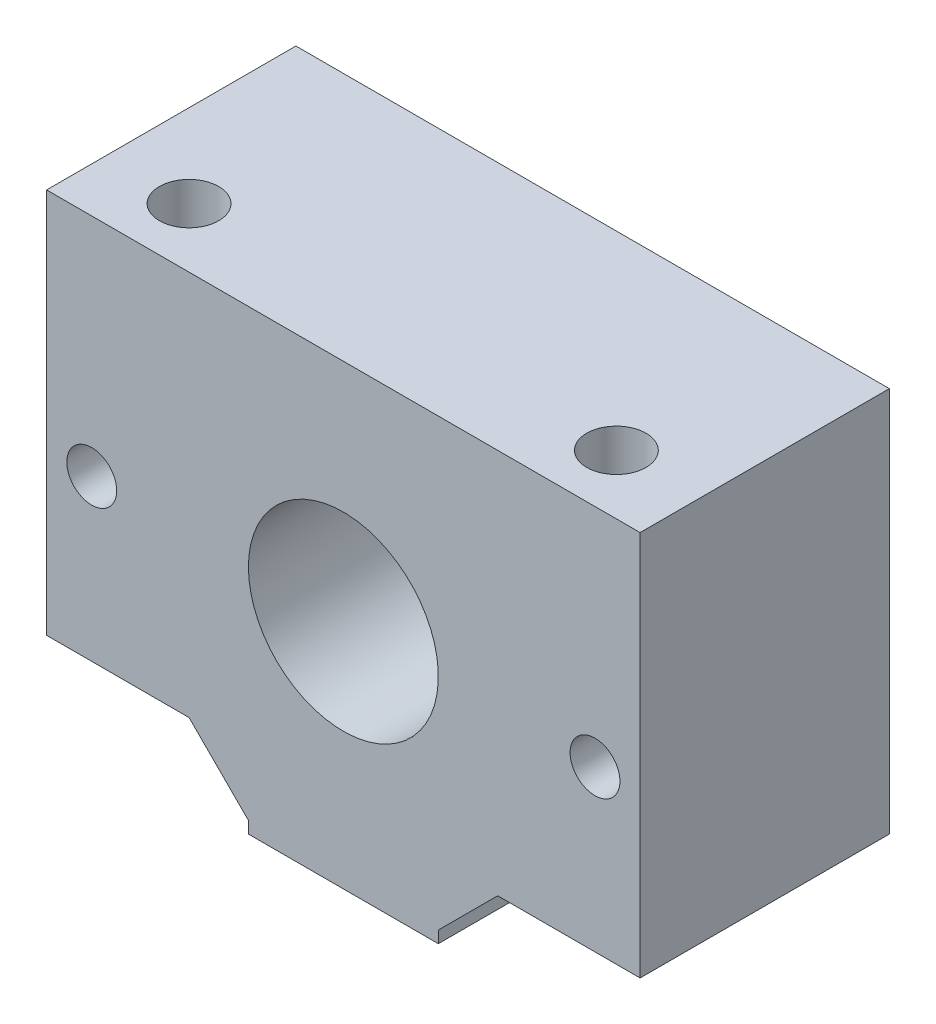
ISO-10303-21;
HEADER;
FILE_DESCRIPTION(('STEP AP214'),'2;1');
FILE_NAME('part.step','',(''),(''),'','','');
FILE_SCHEMA(('AUTOMOTIVE_DESIGN { 1 0 10303 214 1 1 1 1 }'));
ENDSEC;
DATA;
#1=APPLICATION_CONTEXT('core data for automotive mechanical design processes');
#2=APPLICATION_PROTOCOL_DEFINITION('international standard','automotive_design',2000,#1);
#3=PRODUCT_CONTEXT('',#1,'mechanical');
#4=PRODUCT('Part','Part','',(#3));
#5=PRODUCT_RELATED_PRODUCT_CATEGORY('part','',(#4));
#6=PRODUCT_DEFINITION_FORMATION('','',#4);
#7=PRODUCT_DEFINITION_CONTEXT('part definition',#1,'design');
#8=PRODUCT_DEFINITION('design','',#6,#7);
#9=PRODUCT_DEFINITION_SHAPE('','',#8);
#10=(LENGTH_UNIT() NAMED_UNIT(*) SI_UNIT(.MILLI.,.METRE.));
#11=(NAMED_UNIT(*) PLANE_ANGLE_UNIT() SI_UNIT($,.RADIAN.));
#12=(NAMED_UNIT(*) SI_UNIT($,.STERADIAN.) SOLID_ANGLE_UNIT());
#13=UNCERTAINTY_MEASURE_WITH_UNIT(LENGTH_MEASURE(1.E-05),#10,'distance_accuracy_value','');
#14=(GEOMETRIC_REPRESENTATION_CONTEXT(3) GLOBAL_UNCERTAINTY_ASSIGNED_CONTEXT((#13)) GLOBAL_UNIT_ASSIGNED_CONTEXT((#10,
#11,#12)) REPRESENTATION_CONTEXT('',''));
#15=CARTESIAN_POINT('',(0.,0.,0.));
#16=DIRECTION('',(0.,0.,1.));
#17=DIRECTION('',(1.,0.,0.));
#18=AXIS2_PLACEMENT_3D('',#15,#16,#17);
#19=CARTESIAN_POINT('',(-8.,5.99999999999999,21.));
#20=DIRECTION('',(0.,0.,1.));
#21=DIRECTION('',(1.,0.,0.));
#22=AXIS2_PLACEMENT_3D('',#19,#20,#21);
#23=PLANE('',#22);
#24=CARTESIAN_POINT('',(-21.2,19.5,21.));
#25=DIRECTION('',(0.,0.,1.));
#26=DIRECTION('',(1.,0.,0.));
#27=AXIS2_PLACEMENT_3D('',#24,#25,#26);
#28=CIRCLE('',#27,2.09999999999999);
#29=CARTESIAN_POINT('',(-19.1,19.5,21.));
#30=VERTEX_POINT('',#29);
#31=EDGE_CURVE('E300',#30,#30,#28,.T.);
#32=ORIENTED_EDGE('',*,*,#31,.F.);
#33=EDGE_LOOP('',(#32));
#34=FACE_BOUND('',#33,.T.);
#35=CARTESIAN_POINT('',(21.2,19.5,21.));
#36=DIRECTION('',(0.,0.,1.));
#37=DIRECTION('',(1.,0.,0.));
#38=AXIS2_PLACEMENT_3D('',#35,#36,#37);
#39=CIRCLE('',#38,2.09999999999999);
#40=CARTESIAN_POINT('',(23.3,19.5,21.));
#41=VERTEX_POINT('',#40);
#42=EDGE_CURVE('E294',#41,#41,#39,.T.);
#43=ORIENTED_EDGE('',*,*,#42,.F.);
#44=EDGE_LOOP('',(#43));
#45=FACE_BOUND('',#44,.T.);
#46=DIRECTION('',(0.,-1.,0.));
#47=VECTOR('',#46,1.);
#48=CARTESIAN_POINT('',(-8.,0.,21.));
#49=LINE('',#48,#47);
#50=CARTESIAN_POINT('',(-8.,0.999999999999986,21.));
#51=VERTEX_POINT('',#50);
#52=CARTESIAN_POINT('',(-8.,0.,21.));
#53=VERTEX_POINT('',#52);
#54=EDGE_CURVE('E169',#51,#53,#49,.T.);
#55=ORIENTED_EDGE('',*,*,#54,.T.);
#56=DIRECTION('',(1.,0.,0.));
#57=VECTOR('',#56,1.);
#58=CARTESIAN_POINT('',(8.,0.,21.));
#59=LINE('',#58,#57);
#60=CARTESIAN_POINT('',(8.,0.,21.));
#61=VERTEX_POINT('',#60);
#62=EDGE_CURVE('E107',#53,#61,#59,.T.);
#63=ORIENTED_EDGE('',*,*,#62,.T.);
#64=DIRECTION('',(0.,1.,0.));
#65=VECTOR('',#64,1.);
#66=CARTESIAN_POINT('',(8.,0.,21.));
#67=LINE('',#66,#65);
#68=CARTESIAN_POINT('',(8.,0.999999999999986,21.));
#69=VERTEX_POINT('',#68);
#70=EDGE_CURVE('E265',#61,#69,#67,.T.);
#71=ORIENTED_EDGE('',*,*,#70,.T.);
#72=DIRECTION('',(0.707106781186548,0.707106781186547,0.));
#73=VECTOR('',#72,1.);
#74=CARTESIAN_POINT('',(8.,0.999999999999986,21.));
#75=LINE('',#74,#73);
#76=CARTESIAN_POINT('',(13.,5.99999999999999,21.));
#77=VERTEX_POINT('',#76);
#78=EDGE_CURVE('E278',#69,#77,#75,.T.);
#79=ORIENTED_EDGE('',*,*,#78,.T.);
#80=DIRECTION('',(1.,0.,0.));
#81=VECTOR('',#80,1.);
#82=CARTESIAN_POINT('',(13.,5.99999999999999,21.));
#83=LINE('',#82,#81);
#84=CARTESIAN_POINT('',(25.,5.99999999999998,21.));
#85=VERTEX_POINT('',#84);
#86=EDGE_CURVE('E275',#77,#85,#83,.T.);
#87=ORIENTED_EDGE('',*,*,#86,.T.);
#88=DIRECTION('',(0.,1.,0.));
#89=VECTOR('',#88,1.);
#90=CARTESIAN_POINT('',(25.,5.99999999999998,21.));
#91=LINE('',#90,#89);
#92=CARTESIAN_POINT('',(25.,38.5,21.));
#93=VERTEX_POINT('',#92);
#94=EDGE_CURVE('E277',#85,#93,#91,.T.);
#95=ORIENTED_EDGE('',*,*,#94,.T.);
#96=DIRECTION('',(-1.,0.,0.));
#97=VECTOR('',#96,1.);
#98=CARTESIAN_POINT('',(-25.,38.5,21.));
#99=LINE('',#98,#97);
#100=CARTESIAN_POINT('',(-25.,38.5,21.));
#101=VERTEX_POINT('',#100);
#102=EDGE_CURVE('E132',#93,#101,#99,.T.);
#103=ORIENTED_EDGE('',*,*,#102,.T.);
#104=DIRECTION('',(0.,-1.,0.));
#105=VECTOR('',#104,1.);
#106=CARTESIAN_POINT('',(-25.,5.99999999999998,21.));
#107=LINE('',#106,#105);
#108=CARTESIAN_POINT('',(-25.,5.99999999999998,21.));
#109=VERTEX_POINT('',#108);
#110=EDGE_CURVE('E126',#101,#109,#107,.T.);
#111=ORIENTED_EDGE('',*,*,#110,.T.);
#112=DIRECTION('',(1.,0.,0.));
#113=VECTOR('',#112,1.);
#114=CARTESIAN_POINT('',(-13.,5.99999999999999,21.));
#115=LINE('',#114,#113);
#116=CARTESIAN_POINT('',(-13.,5.99999999999999,21.));
#117=VERTEX_POINT('',#116);
#118=EDGE_CURVE('E130',#109,#117,#115,.T.);
#119=ORIENTED_EDGE('',*,*,#118,.T.);
#120=DIRECTION('',(0.707106781186548,-0.707106781186547,0.));
#121=VECTOR('',#120,1.);
#122=CARTESIAN_POINT('',(-8.,0.999999999999986,21.));
#123=LINE('',#122,#121);
#124=EDGE_CURVE('E58',#117,#51,#123,.T.);
#125=ORIENTED_EDGE('',*,*,#124,.T.);
#126=EDGE_LOOP('',(#55,#63,#71,#79,#87,#95,#103,#111,#119,#125));
#127=FACE_BOUND('',#126,.T.);
#128=CARTESIAN_POINT('',(0.,19.5,21.));
#129=DIRECTION('',(0.,0.,1.));
#130=DIRECTION('',(1.,0.,0.));
#131=AXIS2_PLACEMENT_3D('',#128,#129,#130);
#132=CIRCLE('',#131,8.);
#133=CARTESIAN_POINT('',(-8.,19.5,21.));
#134=VERTEX_POINT('',#133);
#135=EDGE_CURVE('E154',#134,#134,#132,.T.);
#136=ORIENTED_EDGE('',*,*,#135,.F.);
#137=EDGE_LOOP('',(#136));
#138=FACE_BOUND('',#137,.T.);
#139=ADVANCED_FACE('F35',(#34,#45,#127,#138),#23,.T.);
#140=CARTESIAN_POINT('',(-8.,5.99999999999999,0.));
#141=DIRECTION('',(0.,0.,1.));
#142=DIRECTION('',(1.,0.,0.));
#143=AXIS2_PLACEMENT_3D('',#140,#141,#142);
#144=PLANE('',#143);
#145=CARTESIAN_POINT('',(-21.2,19.5,0.));
#146=DIRECTION('',(0.,0.,1.));
#147=DIRECTION('',(1.,0.,0.));
#148=AXIS2_PLACEMENT_3D('',#145,#146,#147);
#149=CIRCLE('',#148,2.1);
#150=CARTESIAN_POINT('',(-19.1,19.5,0.));
#151=VERTEX_POINT('',#150);
#152=EDGE_CURVE('E297',#151,#151,#149,.T.);
#153=ORIENTED_EDGE('',*,*,#152,.T.);
#154=EDGE_LOOP('',(#153));
#155=FACE_BOUND('',#154,.T.);
#156=CARTESIAN_POINT('',(21.2,19.5,0.));
#157=DIRECTION('',(0.,0.,1.));
#158=DIRECTION('',(1.,0.,0.));
#159=AXIS2_PLACEMENT_3D('',#156,#157,#158);
#160=CIRCLE('',#159,2.09999999999999);
#161=CARTESIAN_POINT('',(23.3,19.5,0.));
#162=VERTEX_POINT('',#161);
#163=EDGE_CURVE('E289',#162,#162,#160,.T.);
#164=ORIENTED_EDGE('',*,*,#163,.T.);
#165=EDGE_LOOP('',(#164));
#166=FACE_BOUND('',#165,.T.);
#167=DIRECTION('',(0.,-1.,0.));
#168=VECTOR('',#167,1.);
#169=CARTESIAN_POINT('',(-8.,0.,0.));
#170=LINE('',#169,#168);
#171=CARTESIAN_POINT('',(-8.,0.999999999999986,0.));
#172=VERTEX_POINT('',#171);
#173=CARTESIAN_POINT('',(-8.,0.,0.));
#174=VERTEX_POINT('',#173);
#175=EDGE_CURVE('E150',#172,#174,#170,.T.);
#176=ORIENTED_EDGE('',*,*,#175,.F.);
#177=DIRECTION('',(0.707106781186548,-0.707106781186547,0.));
#178=VECTOR('',#177,1.);
#179=CARTESIAN_POINT('',(-8.,0.999999999999986,0.));
#180=LINE('',#179,#178);
#181=CARTESIAN_POINT('',(-13.,5.99999999999999,0.));
#182=VERTEX_POINT('',#181);
#183=EDGE_CURVE('E99',#182,#172,#180,.T.);
#184=ORIENTED_EDGE('',*,*,#183,.F.);
#185=DIRECTION('',(1.,0.,0.));
#186=VECTOR('',#185,1.);
#187=CARTESIAN_POINT('',(-13.,5.99999999999999,0.));
#188=LINE('',#187,#186);
#189=CARTESIAN_POINT('',(-25.,5.99999999999998,0.));
#190=VERTEX_POINT('',#189);
#191=EDGE_CURVE('E93',#190,#182,#188,.T.);
#192=ORIENTED_EDGE('',*,*,#191,.F.);
#193=DIRECTION('',(0.,-1.,0.));
#194=VECTOR('',#193,1.);
#195=CARTESIAN_POINT('',(-25.,5.99999999999998,0.));
#196=LINE('',#195,#194);
#197=CARTESIAN_POINT('',(-25.,38.5,0.));
#198=VERTEX_POINT('',#197);
#199=EDGE_CURVE('E140',#198,#190,#196,.T.);
#200=ORIENTED_EDGE('',*,*,#199,.F.);
#201=DIRECTION('',(-1.,0.,0.));
#202=VECTOR('',#201,1.);
#203=CARTESIAN_POINT('',(-25.,38.5,0.));
#204=LINE('',#203,#202);
#205=CARTESIAN_POINT('',(25.,38.5,0.));
#206=VERTEX_POINT('',#205);
#207=EDGE_CURVE('E164',#206,#198,#204,.T.);
#208=ORIENTED_EDGE('',*,*,#207,.F.);
#209=DIRECTION('',(0.,1.,0.));
#210=VECTOR('',#209,1.);
#211=CARTESIAN_POINT('',(25.,5.99999999999998,0.));
#212=LINE('',#211,#210);
#213=CARTESIAN_POINT('',(25.,5.99999999999998,0.));
#214=VERTEX_POINT('',#213);
#215=EDGE_CURVE('E162',#214,#206,#212,.T.);
#216=ORIENTED_EDGE('',*,*,#215,.F.);
#217=DIRECTION('',(1.,0.,0.));
#218=VECTOR('',#217,1.);
#219=CARTESIAN_POINT('',(13.,5.99999999999999,0.));
#220=LINE('',#219,#218);
#221=CARTESIAN_POINT('',(13.,5.99999999999999,0.));
#222=VERTEX_POINT('',#221);
#223=EDGE_CURVE('E160',#222,#214,#220,.T.);
#224=ORIENTED_EDGE('',*,*,#223,.F.);
#225=DIRECTION('',(0.707106781186548,0.707106781186547,0.));
#226=VECTOR('',#225,1.);
#227=CARTESIAN_POINT('',(8.,0.999999999999986,0.));
#228=LINE('',#227,#226);
#229=CARTESIAN_POINT('',(8.,0.999999999999986,0.));
#230=VERTEX_POINT('',#229);
#231=EDGE_CURVE('E158',#230,#222,#228,.T.);
#232=ORIENTED_EDGE('',*,*,#231,.F.);
#233=DIRECTION('',(0.,1.,0.));
#234=VECTOR('',#233,1.);
#235=CARTESIAN_POINT('',(8.,0.,0.));
#236=LINE('',#235,#234);
#237=CARTESIAN_POINT('',(8.,0.,0.));
#238=VERTEX_POINT('',#237);
#239=EDGE_CURVE('E156',#238,#230,#236,.T.);
#240=ORIENTED_EDGE('',*,*,#239,.F.);
#241=DIRECTION('',(1.,0.,0.));
#242=VECTOR('',#241,1.);
#243=CARTESIAN_POINT('',(8.,0.,0.));
#244=LINE('',#243,#242);
#245=EDGE_CURVE('E153',#174,#238,#244,.T.);
#246=ORIENTED_EDGE('',*,*,#245,.F.);
#247=EDGE_LOOP('',(#176,#184,#192,#200,#208,#216,#224,#232,#240,#246));
#248=FACE_BOUND('',#247,.T.);
#249=CARTESIAN_POINT('',(0.,19.5,0.));
#250=DIRECTION('',(0.,0.,1.));
#251=DIRECTION('',(1.,0.,0.));
#252=AXIS2_PLACEMENT_3D('',#249,#250,#251);
#253=CIRCLE('',#252,8.);
#254=CARTESIAN_POINT('',(-8.,19.5,0.));
#255=VERTEX_POINT('',#254);
#256=EDGE_CURVE('E286',#255,#255,#253,.T.);
#257=ORIENTED_EDGE('',*,*,#256,.T.);
#258=EDGE_LOOP('',(#257));
#259=FACE_BOUND('',#258,.T.);
#260=ADVANCED_FACE('F215',(#155,#166,#248,#259),#144,.F.);
#261=CARTESIAN_POINT('',(-8.,0.,21.));
#262=DIRECTION('',(1.,0.,0.));
#263=DIRECTION('',(0.,0.,-1.));
#264=AXIS2_PLACEMENT_3D('',#261,#262,#263);
#265=PLANE('',#264);
#266=ORIENTED_EDGE('',*,*,#175,.T.);
#267=DIRECTION('',(0.,0.,-1.));
#268=VECTOR('',#267,1.);
#269=CARTESIAN_POINT('',(-8.,0.,21.));
#270=LINE('',#269,#268);
#271=EDGE_CURVE('E11',#53,#174,#270,.T.);
#272=ORIENTED_EDGE('',*,*,#271,.F.);
#273=ORIENTED_EDGE('',*,*,#54,.F.);
#274=DIRECTION('',(0.,0.,-1.));
#275=VECTOR('',#274,1.);
#276=CARTESIAN_POINT('',(-8.,0.999999999999986,21.));
#277=LINE('',#276,#275);
#278=EDGE_CURVE('E146',#51,#172,#277,.T.);
#279=ORIENTED_EDGE('',*,*,#278,.T.);
#280=EDGE_LOOP('',(#266,#272,#273,#279));
#281=FACE_BOUND('',#280,.T.);
#282=ADVANCED_FACE('F37',(#281),#265,.F.);
#283=CARTESIAN_POINT('',(8.,0.,21.));
#284=DIRECTION('',(0.,1.,0.));
#285=DIRECTION('',(0.,0.,1.));
#286=AXIS2_PLACEMENT_3D('',#283,#284,#285);
#287=PLANE('',#286);
#288=ORIENTED_EDGE('',*,*,#245,.T.);
#289=DIRECTION('',(0.,0.,-1.));
#290=VECTOR('',#289,1.);
#291=CARTESIAN_POINT('',(8.,0.,21.));
#292=LINE('',#291,#290);
#293=EDGE_CURVE('E49',#61,#238,#292,.T.);
#294=ORIENTED_EDGE('',*,*,#293,.F.);
#295=ORIENTED_EDGE('',*,*,#62,.F.);
#296=ORIENTED_EDGE('',*,*,#271,.T.);
#297=EDGE_LOOP('',(#288,#294,#295,#296));
#298=FACE_BOUND('',#297,.T.);
#299=ADVANCED_FACE('F252',(#298),#287,.F.);
#300=CARTESIAN_POINT('',(8.,0.,21.));
#301=DIRECTION('',(-1.,0.,0.));
#302=DIRECTION('',(0.,0.,1.));
#303=AXIS2_PLACEMENT_3D('',#300,#301,#302);
#304=PLANE('',#303);
#305=ORIENTED_EDGE('',*,*,#239,.T.);
#306=DIRECTION('',(0.,0.,-1.));
#307=VECTOR('',#306,1.);
#308=CARTESIAN_POINT('',(8.,0.999999999999986,21.));
#309=LINE('',#308,#307);
#310=EDGE_CURVE('E182',#69,#230,#309,.T.);
#311=ORIENTED_EDGE('',*,*,#310,.F.);
#312=ORIENTED_EDGE('',*,*,#70,.F.);
#313=ORIENTED_EDGE('',*,*,#293,.T.);
#314=EDGE_LOOP('',(#305,#311,#312,#313));
#315=FACE_BOUND('',#314,.T.);
#316=ADVANCED_FACE('F249',(#315),#304,.F.);
#317=CARTESIAN_POINT('',(8.,0.999999999999986,21.));
#318=DIRECTION('',(-0.707106781186547,0.707106781186548,0.));
#319=DIRECTION('',(-0.707106781186548,-0.707106781186547,0.));
#320=AXIS2_PLACEMENT_3D('',#317,#318,#319);
#321=PLANE('',#320);
#322=ORIENTED_EDGE('',*,*,#231,.T.);
#323=DIRECTION('',(0.,0.,-1.));
#324=VECTOR('',#323,1.);
#325=CARTESIAN_POINT('',(13.,5.99999999999999,21.));
#326=LINE('',#325,#324);
#327=EDGE_CURVE('E179',#77,#222,#326,.T.);
#328=ORIENTED_EDGE('',*,*,#327,.F.);
#329=ORIENTED_EDGE('',*,*,#78,.F.);
#330=ORIENTED_EDGE('',*,*,#310,.T.);
#331=EDGE_LOOP('',(#322,#328,#329,#330));
#332=FACE_BOUND('',#331,.T.);
#333=ADVANCED_FACE('F245',(#332),#321,.F.);
#334=CARTESIAN_POINT('',(13.,5.99999999999999,21.));
#335=DIRECTION('',(0.,1.,0.));
#336=DIRECTION('',(-1.,0.,0.));
#337=AXIS2_PLACEMENT_3D('',#334,#335,#336);
#338=PLANE('',#337);
#339=CARTESIAN_POINT('',(18.,5.99999999999998,16.));
#340=DIRECTION('',(0.,1.,0.));
#341=DIRECTION('',(-1.,0.,0.));
#342=AXIS2_PLACEMENT_3D('',#339,#340,#341);
#343=CIRCLE('',#342,2.49999999999999);
#344=CARTESIAN_POINT('',(15.5,5.99999999999998,16.));
#345=VERTEX_POINT('',#344);
#346=EDGE_CURVE('E192',#345,#345,#343,.T.);
#347=ORIENTED_EDGE('',*,*,#346,.T.);
#348=EDGE_LOOP('',(#347));
#349=FACE_BOUND('',#348,.T.);
#350=ORIENTED_EDGE('',*,*,#223,.T.);
#351=DIRECTION('',(0.,0.,-1.));
#352=VECTOR('',#351,1.);
#353=CARTESIAN_POINT('',(25.,5.99999999999998,21.));
#354=LINE('',#353,#352);
#355=EDGE_CURVE('E176',#85,#214,#354,.T.);
#356=ORIENTED_EDGE('',*,*,#355,.F.);
#357=ORIENTED_EDGE('',*,*,#86,.F.);
#358=ORIENTED_EDGE('',*,*,#327,.T.);
#359=EDGE_LOOP('',(#350,#356,#357,#358));
#360=FACE_BOUND('',#359,.T.);
#361=ADVANCED_FACE('F241',(#349,#360),#338,.F.);
#362=CARTESIAN_POINT('',(25.,5.99999999999998,21.));
#363=DIRECTION('',(-1.,0.,0.));
#364=DIRECTION('',(0.,0.,1.));
#365=AXIS2_PLACEMENT_3D('',#362,#363,#364);
#366=PLANE('',#365);
#367=ORIENTED_EDGE('',*,*,#215,.T.);
#368=DIRECTION('',(0.,0.,-1.));
#369=VECTOR('',#368,1.);
#370=CARTESIAN_POINT('',(25.,38.5,21.));
#371=LINE('',#370,#369);
#372=EDGE_CURVE('E173',#93,#206,#371,.T.);
#373=ORIENTED_EDGE('',*,*,#372,.F.);
#374=ORIENTED_EDGE('',*,*,#94,.F.);
#375=ORIENTED_EDGE('',*,*,#355,.T.);
#376=EDGE_LOOP('',(#367,#373,#374,#375));
#377=FACE_BOUND('',#376,.T.);
#378=ADVANCED_FACE('F237',(#377),#366,.F.);
#379=CARTESIAN_POINT('',(-25.,38.5,21.));
#380=DIRECTION('',(0.,-1.,0.));
#381=DIRECTION('',(0.,0.,-1.));
#382=AXIS2_PLACEMENT_3D('',#379,#380,#381);
#383=PLANE('',#382);
#384=CARTESIAN_POINT('',(-18.,38.5,16.));
#385=DIRECTION('',(0.,1.,0.));
#386=DIRECTION('',(0.,0.,1.));
#387=AXIS2_PLACEMENT_3D('',#384,#385,#386);
#388=CIRCLE('',#387,2.49999999999999);
#389=CARTESIAN_POINT('',(-18.,38.5,18.5));
#390=VERTEX_POINT('',#389);
#391=EDGE_CURVE('E310',#390,#390,#388,.T.);
#392=ORIENTED_EDGE('',*,*,#391,.F.);
#393=EDGE_LOOP('',(#392));
#394=FACE_BOUND('',#393,.T.);
#395=CARTESIAN_POINT('',(18.,38.5,16.));
#396=DIRECTION('',(0.,1.,0.));
#397=DIRECTION('',(0.,0.,1.));
#398=AXIS2_PLACEMENT_3D('',#395,#396,#397);
#399=CIRCLE('',#398,2.49999999999999);
#400=CARTESIAN_POINT('',(18.,38.5,18.5));
#401=VERTEX_POINT('',#400);
#402=EDGE_CURVE('E193',#401,#401,#399,.T.);
#403=ORIENTED_EDGE('',*,*,#402,.F.);
#404=EDGE_LOOP('',(#403));
#405=FACE_BOUND('',#404,.T.);
#406=ORIENTED_EDGE('',*,*,#207,.T.);
#407=DIRECTION('',(0.,0.,-1.));
#408=VECTOR('',#407,1.);
#409=CARTESIAN_POINT('',(-25.,38.5,21.));
#410=LINE('',#409,#408);
#411=EDGE_CURVE('E141',#101,#198,#410,.T.);
#412=ORIENTED_EDGE('',*,*,#411,.F.);
#413=ORIENTED_EDGE('',*,*,#102,.F.);
#414=ORIENTED_EDGE('',*,*,#372,.T.);
#415=EDGE_LOOP('',(#406,#412,#413,#414));
#416=FACE_BOUND('',#415,.T.);
#417=ADVANCED_FACE('F234',(#394,#405,#416),#383,.F.);
#418=CARTESIAN_POINT('',(-25.,5.99999999999998,21.));
#419=DIRECTION('',(1.,0.,0.));
#420=DIRECTION('',(0.,0.,-1.));
#421=AXIS2_PLACEMENT_3D('',#418,#419,#420);
#422=PLANE('',#421);
#423=ORIENTED_EDGE('',*,*,#199,.T.);
#424=DIRECTION('',(0.,0.,-1.));
#425=VECTOR('',#424,1.);
#426=CARTESIAN_POINT('',(-25.,5.99999999999998,21.));
#427=LINE('',#426,#425);
#428=EDGE_CURVE('E137',#109,#190,#427,.T.);
#429=ORIENTED_EDGE('',*,*,#428,.F.);
#430=ORIENTED_EDGE('',*,*,#110,.F.);
#431=ORIENTED_EDGE('',*,*,#411,.T.);
#432=EDGE_LOOP('',(#423,#429,#430,#431));
#433=FACE_BOUND('',#432,.T.);
#434=ADVANCED_FACE('F138',(#433),#422,.F.);
#435=CARTESIAN_POINT('',(-13.,5.99999999999999,21.));
#436=DIRECTION('',(0.,1.,0.));
#437=DIRECTION('',(-1.,0.,0.));
#438=AXIS2_PLACEMENT_3D('',#435,#436,#437);
#439=PLANE('',#438);
#440=CARTESIAN_POINT('',(-18.,5.99999999999998,16.));
#441=DIRECTION('',(0.,1.,0.));
#442=DIRECTION('',(-1.,0.,0.));
#443=AXIS2_PLACEMENT_3D('',#440,#441,#442);
#444=CIRCLE('',#443,2.49999999999999);
#445=CARTESIAN_POINT('',(-20.5,5.99999999999998,16.));
#446=VERTEX_POINT('',#445);
#447=EDGE_CURVE('E307',#446,#446,#444,.T.);
#448=ORIENTED_EDGE('',*,*,#447,.T.);
#449=EDGE_LOOP('',(#448));
#450=FACE_BOUND('',#449,.T.);
#451=ORIENTED_EDGE('',*,*,#191,.T.);
#452=DIRECTION('',(0.,0.,-1.));
#453=VECTOR('',#452,1.);
#454=CARTESIAN_POINT('',(-13.,5.99999999999999,21.));
#455=LINE('',#454,#453);
#456=EDGE_CURVE('E142',#117,#182,#455,.T.);
#457=ORIENTED_EDGE('',*,*,#456,.F.);
#458=ORIENTED_EDGE('',*,*,#118,.F.);
#459=ORIENTED_EDGE('',*,*,#428,.T.);
#460=EDGE_LOOP('',(#451,#457,#458,#459));
#461=FACE_BOUND('',#460,.T.);
#462=ADVANCED_FACE('F144',(#450,#461),#439,.F.);
#463=CARTESIAN_POINT('',(-8.,0.999999999999986,21.));
#464=DIRECTION('',(0.707106781186547,0.707106781186548,0.));
#465=DIRECTION('',(-0.707106781186548,0.707106781186547,0.));
#466=AXIS2_PLACEMENT_3D('',#463,#464,#465);
#467=PLANE('',#466);
#468=ORIENTED_EDGE('',*,*,#183,.T.);
#469=ORIENTED_EDGE('',*,*,#278,.F.);
#470=ORIENTED_EDGE('',*,*,#124,.F.);
#471=ORIENTED_EDGE('',*,*,#456,.T.);
#472=EDGE_LOOP('',(#468,#469,#470,#471));
#473=FACE_BOUND('',#472,.T.);
#474=ADVANCED_FACE('F226',(#473),#467,.F.);
#475=CARTESIAN_POINT('',(0.,19.5,21.));
#476=DIRECTION('',(0.,0.,-1.));
#477=DIRECTION('',(-1.,0.,0.));
#478=AXIS2_PLACEMENT_3D('',#475,#476,#477);
#479=CYLINDRICAL_SURFACE('',#478,8.);
#480=CARTESIAN_POINT('',(-8.,19.5,21.));
#481=CARTESIAN_POINT('',(-8.,19.5,20.78125));
#482=CARTESIAN_POINT('',(-8.,19.5,20.5625));
#483=CARTESIAN_POINT('',(-8.,19.5,20.125));
#484=CARTESIAN_POINT('',(-8.,19.5,19.90625));
#485=CARTESIAN_POINT('',(-8.,19.5,19.46875));
#486=CARTESIAN_POINT('',(-8.,19.5,19.25));
#487=CARTESIAN_POINT('',(-8.,19.5,18.8125));
#488=CARTESIAN_POINT('',(-8.,19.5,18.59375));
#489=CARTESIAN_POINT('',(-8.,19.5,18.15625));
#490=CARTESIAN_POINT('',(-8.,19.5,17.9375));
#491=CARTESIAN_POINT('',(-8.,19.5,17.5));
#492=CARTESIAN_POINT('',(-8.,19.5,17.28125));
#493=CARTESIAN_POINT('',(-8.,19.5,16.84375));
#494=CARTESIAN_POINT('',(-8.,19.5,16.625));
#495=CARTESIAN_POINT('',(-8.,19.5,16.1875));
#496=CARTESIAN_POINT('',(-8.,19.5,15.96875));
#497=CARTESIAN_POINT('',(-8.,19.5,15.53125));
#498=CARTESIAN_POINT('',(-8.,19.5,15.3125));
#499=CARTESIAN_POINT('',(-8.,19.5,14.875));
#500=CARTESIAN_POINT('',(-8.,19.5,14.65625));
#501=CARTESIAN_POINT('',(-8.,19.5,14.21875));
#502=CARTESIAN_POINT('',(-8.,19.5,14.));
#503=CARTESIAN_POINT('',(-8.,19.5,13.5625));
#504=CARTESIAN_POINT('',(-8.,19.5,13.34375));
#505=CARTESIAN_POINT('',(-8.,19.5,12.90625));
#506=CARTESIAN_POINT('',(-8.,19.5,12.6875));
#507=CARTESIAN_POINT('',(-8.,19.5,12.25));
#508=CARTESIAN_POINT('',(-8.,19.5,12.03125));
#509=CARTESIAN_POINT('',(-8.,19.5,11.59375));
#510=CARTESIAN_POINT('',(-8.,19.5,11.375));
#511=CARTESIAN_POINT('',(-8.,19.5,10.9375));
#512=CARTESIAN_POINT('',(-8.,19.5,10.71875));
#513=CARTESIAN_POINT('',(-8.,19.5,10.28125));
#514=CARTESIAN_POINT('',(-8.,19.5,10.0625));
#515=CARTESIAN_POINT('',(-8.,19.5,9.625));
#516=CARTESIAN_POINT('',(-8.,19.5,9.40625));
#517=CARTESIAN_POINT('',(-8.,19.5,8.96875));
#518=CARTESIAN_POINT('',(-8.,19.5,8.75));
#519=CARTESIAN_POINT('',(-8.,19.5,8.3125));
#520=CARTESIAN_POINT('',(-8.,19.5,8.09375));
#521=CARTESIAN_POINT('',(-8.,19.5,7.65625));
#522=CARTESIAN_POINT('',(-8.,19.5,7.4375));
#523=CARTESIAN_POINT('',(-8.,19.5,7.));
#524=CARTESIAN_POINT('',(-8.,19.5,6.78125));
#525=CARTESIAN_POINT('',(-8.,19.5,6.34375));
#526=CARTESIAN_POINT('',(-8.,19.5,6.125));
#527=CARTESIAN_POINT('',(-8.,19.5,5.6875));
#528=CARTESIAN_POINT('',(-8.,19.5,5.46875));
#529=CARTESIAN_POINT('',(-8.,19.5,5.03125));
#530=CARTESIAN_POINT('',(-8.,19.5,4.8125));
#531=CARTESIAN_POINT('',(-8.,19.5,4.375));
#532=CARTESIAN_POINT('',(-8.,19.5,4.15625));
#533=CARTESIAN_POINT('',(-8.,19.5,3.71875));
#534=CARTESIAN_POINT('',(-8.,19.5,3.5));
#535=CARTESIAN_POINT('',(-8.,19.5,3.0625));
#536=CARTESIAN_POINT('',(-8.,19.5,2.84375));
#537=CARTESIAN_POINT('',(-8.,19.5,2.40625));
#538=CARTESIAN_POINT('',(-8.,19.5,2.1875));
#539=CARTESIAN_POINT('',(-8.,19.5,1.75));
#540=CARTESIAN_POINT('',(-8.,19.5,1.53125));
#541=CARTESIAN_POINT('',(-8.,19.5,1.09375));
#542=CARTESIAN_POINT('',(-8.,19.5,0.875000000000001));
#543=CARTESIAN_POINT('',(-8.,19.5,0.4375));
#544=CARTESIAN_POINT('',(-8.,19.5,0.21875));
#545=CARTESIAN_POINT('',(-8.,19.5,0.));
#546=B_SPLINE_CURVE_WITH_KNOTS('',3,(#480,#481,#482,#483,#484,#485,#486,#487,#488,#489,#490,
#491,#492,#493,#494,#495,#496,#497,#498,#499,#500,#501,#502,#503,#504,#505,#506,#507,#508,#509,
#510,#511,#512,#513,#514,#515,#516,#517,#518,#519,#520,#521,#522,#523,#524,#525,#526,#527,#528,
#529,#530,#531,#532,#533,#534,#535,#536,#537,#538,#539,#540,#541,#542,#543,#544,#545),
.UNSPECIFIED.,.F.,.F.,(4,2,2,2,2,2,2,2,2,2,2,2,2,2,2,2,2,2,2,2,2,2,2,2,2,2,2,2,2,2,2,2,4),(0.,
0.656249999999997,1.3125,1.96875,2.625,3.28125,3.9375,4.59375,5.25,5.90625,6.5625,7.21875,7.875,
8.53125,9.1875,9.84375,10.5,11.15625,11.8125,12.46875,13.125,13.78125,14.4375,15.09375,15.75,
16.40625,17.0625,17.71875,18.375,19.03125,19.6875,20.34375,21.),.UNSPECIFIED.);
#547=EDGE_CURVE('BSEAM210',#134,#255,#546,.T.);
#548=ORIENTED_EDGE('',*,*,#135,.T.);
#549=ORIENTED_EDGE('',*,*,#256,.F.);
#550=ORIENTED_EDGE('',*,*,#547,.T.);
#551=ORIENTED_EDGE('',*,*,#547,.F.);
#552=EDGE_LOOP('',(#548,#550,#549,#551));
#553=FACE_BOUND('',#552,.T.);
#554=ADVANCED_FACE('F210',(#553),#479,.F.);
#555=CARTESIAN_POINT('',(21.2,19.5,21.));
#556=DIRECTION('',(0.,0.,1.));
#557=DIRECTION('',(1.,0.,0.));
#558=AXIS2_PLACEMENT_3D('',#555,#556,#557);
#559=CYLINDRICAL_SURFACE('',#558,2.09999999999999);
#560=CARTESIAN_POINT('',(19.1,19.5,13.7550055679356));
#561=CARTESIAN_POINT('',(19.1000051974505,19.3966815992943,13.7550018119441));
#562=CARTESIAN_POINT('',(19.1076594967822,19.2932855370379,13.7587085043693));
#563=CARTESIAN_POINT('',(19.1379842696764,19.0891998260586,13.773956266454));
#564=CARTESIAN_POINT('',(19.1606743747851,18.9885138949131,13.785507578956));
#565=CARTESIAN_POINT('',(19.220057642718,18.792681415827,13.8176623067301));
#566=CARTESIAN_POINT('',(19.2567702564892,18.6975427749123,13.8382783018656));
#567=CARTESIAN_POINT('',(19.3421130498353,18.5159769140341,13.8902107727518));
#568=CARTESIAN_POINT('',(19.3907337444602,18.4295428377116,13.921518739989));
#569=CARTESIAN_POINT('',(19.4949458606844,18.2705525503866,13.995240069803));
#570=CARTESIAN_POINT('',(19.5502699194869,18.1976453368419,14.0372731453935));
#571=CARTESIAN_POINT('',(19.6649843828705,18.0642175521122,14.1336094911282));
#572=CARTESIAN_POINT('',(19.7243737008053,18.0036936879714,14.1879094911736));
#573=CARTESIAN_POINT('',(19.8403589996704,17.8977150153085,14.3059968731808));
#574=CARTESIAN_POINT('',(19.8969714980847,17.8517532776844,14.3693165192878));
#575=CARTESIAN_POINT('',(20.0061995655304,17.7709926200439,14.5057425769906));
#576=CARTESIAN_POINT('',(20.0588136310451,17.7361978834192,14.5788526417794));
#577=CARTESIAN_POINT('',(20.1602973944514,17.6744096822512,14.7380269091796));
#578=CARTESIAN_POINT('',(20.2087212311002,17.6480471379279,14.8246174590719));
#579=CARTESIAN_POINT('',(20.2955447280111,17.6041278315202,15.0047632299241));
#580=CARTESIAN_POINT('',(20.3339389412221,17.5865758496706,15.0983222001092));
#581=CARTESIAN_POINT('',(20.4040243974212,17.5562665594663,15.304206157055));
#582=CARTESIAN_POINT('',(20.4339472024859,17.5445675610727,15.417290144575));
#583=CARTESIAN_POINT('',(20.4777218552421,17.5279814842226,15.6470244977199));
#584=CARTESIAN_POINT('',(20.4915654477426,17.5230979045952,15.7636766637611));
#585=CARTESIAN_POINT('',(20.5033333548309,17.5189109493985,16.0101880978635));
#586=CARTESIAN_POINT('',(20.4994330299465,17.5202475085394,16.1401477277786));
#587=CARTESIAN_POINT('',(20.4715491229293,17.5303337983583,16.3977522709354));
#588=CARTESIAN_POINT('',(20.4475552109153,17.5390873420498,16.525395959088));
#589=CARTESIAN_POINT('',(20.3970296713097,17.5594968949423,16.713138291251));
#590=CARTESIAN_POINT('',(20.3775397991907,17.5676125198055,16.7756041316274));
#591=CARTESIAN_POINT('',(20.3338994697597,17.5867714498077,16.8984149912262));
#592=CARTESIAN_POINT('',(20.3097511323347,17.5978134241295,16.9587609604103));
#593=CARTESIAN_POINT('',(20.2571553517496,17.6233285256155,17.0767648106955));
#594=CARTESIAN_POINT('',(20.228709857176,17.6378000992785,17.1344238947622));
#595=CARTESIAN_POINT('',(20.1680110493227,17.6707404501898,17.2465098025973));
#596=CARTESIAN_POINT('',(20.1357582832576,17.6892086533245,17.3009370891823));
#597=CARTESIAN_POINT('',(20.070973626089,17.7289501217924,17.4015495739823));
#598=CARTESIAN_POINT('',(20.0386946704325,17.7498554679473,17.4480427603272));
#599=CARTESIAN_POINT('',(19.9721778020407,17.7958617321652,17.5374056164319));
#600=CARTESIAN_POINT('',(19.9379403008955,17.8209617708246,17.580276042861));
#601=CARTESIAN_POINT('',(19.8683382249567,17.8756144103053,17.6619830139238));
#602=CARTESIAN_POINT('',(19.8329751200436,17.9051613781256,17.7008245583413));
#603=CARTESIAN_POINT('',(19.7620008364458,17.9688443616114,17.7742506741759));
#604=CARTESIAN_POINT('',(19.7263897023469,18.0029795717046,17.8088359908353));
#605=CARTESIAN_POINT('',(19.6314038724832,18.1011301022017,17.8960664137347));
#606=CARTESIAN_POINT('',(19.572645902038,18.1694707426121,17.9446376323925));
#607=CARTESIAN_POINT('',(19.4617060804989,18.3180775813011,18.0293664009548));
#608=CARTESIAN_POINT('',(19.4095251187598,18.3983453892015,18.0655222731719));
#609=CARTESIAN_POINT('',(19.317883625704,18.563984621859,18.1250921838401));
#610=CARTESIAN_POINT('',(19.2778959987234,18.6488610489386,18.1490793447348));
#611=CARTESIAN_POINT('',(19.2092176838329,18.824927737171,18.1884620713134));
#612=CARTESIAN_POINT('',(19.1805286265709,18.9161189074576,18.2038563969838));
#613=CARTESIAN_POINT('',(19.1346345817852,19.1070847752352,18.2278500059799));
#614=CARTESIAN_POINT('',(19.1180711574379,19.2070608256296,18.2360735849679));
#615=CARTESIAN_POINT('',(19.0995419926752,19.4086993499421,18.2452422839123));
#616=CARTESIAN_POINT('',(19.0975806859209,19.5103623266742,18.2461851932323));
#617=CARTESIAN_POINT('',(19.1085700485633,19.7168933218804,18.2407847624986));
#618=CARTESIAN_POINT('',(19.1221360151622,19.8217216440356,18.2341408035641));
#619=CARTESIAN_POINT('',(19.1645791895302,20.0273297051441,18.2123109922628));
#620=CARTESIAN_POINT('',(19.1934565102866,20.1281094142155,18.1971250768622));
#621=CARTESIAN_POINT('',(19.2647286391307,20.3217514426612,18.1568760736333));
#622=CARTESIAN_POINT('',(19.307012624178,20.4146710274367,18.1318935795362));
#623=CARTESIAN_POINT('',(19.4025293026239,20.5904522184545,18.0702942526746));
#624=CARTESIAN_POINT('',(19.4557543104367,20.6733208204464,18.0336855770056));
#625=CARTESIAN_POINT('',(19.5662088818451,20.8224539529892,17.9497494898976));
#626=CARTESIAN_POINT('',(19.6230752022412,20.8893669284869,17.9030952632796));
#627=CARTESIAN_POINT('',(19.7389427519783,21.0107477394708,17.7978283080027));
#628=CARTESIAN_POINT('',(19.7979436798858,21.0652173242368,17.7392172624174));
#629=CARTESIAN_POINT('',(19.9123592065325,21.1605433702738,17.6124475876386));
#630=CARTESIAN_POINT('',(19.967826671148,21.2017075572801,17.544565933421));
#631=CARTESIAN_POINT('',(20.073408647796,21.2733793752473,17.3996516375499));
#632=CARTESIAN_POINT('',(20.1235207949655,21.3038823116796,17.3226149845808));
#633=CARTESIAN_POINT('',(20.2199737814524,21.3581948652928,17.1541008232874));
#634=CARTESIAN_POINT('',(20.2655959060514,21.3811804329983,17.0619491784196));
#635=CARTESIAN_POINT('',(20.3455473669558,21.4188184640311,16.8712755220034));
#636=CARTESIAN_POINT('',(20.379870435525,21.4334663055847,16.7727500109199));
#637=CARTESIAN_POINT('',(20.4401452610245,21.4580210303286,16.5567906919224));
#638=CARTESIAN_POINT('',(20.4641450326757,21.4669244105659,16.4386954478465));
#639=CARTESIAN_POINT('',(20.4949000207053,21.4781546552977,16.199953263658));
#640=CARTESIAN_POINT('',(20.501646582538,21.4804782192911,16.0793050735196));
#641=CARTESIAN_POINT('',(20.4975028663487,21.4790192245959,15.8278875041804));
#642=CARTESIAN_POINT('',(20.4850369502444,21.4746912489499,15.6971451173873));
#643=CARTESIAN_POINT('',(20.4398755728057,21.4577528941515,15.4395840058381));
#644=CARTESIAN_POINT('',(20.407171412983,21.4451389535107,15.3127669928479));
#645=CARTESIAN_POINT('',(20.344205689007,21.4178411630375,15.1288423823943));
#646=CARTESIAN_POINT('',(20.320922163296,21.4073570551331,15.0686283321895));
#647=CARTESIAN_POINT('',(20.2700594209459,21.3830851838988,14.9507434583413));
#648=CARTESIAN_POINT('',(20.2424823826543,21.3692990939565,14.893071363951));
#649=CARTESIAN_POINT('',(20.1835125266125,21.3378971385727,14.7808656398109));
#650=CARTESIAN_POINT('',(20.1521230340225,21.3202846000695,14.7263293353913));
#651=CARTESIAN_POINT('',(20.0861377806306,21.2806713420484,14.6209088456363));
#652=CARTESIAN_POINT('',(20.0515426109228,21.2586714306585,14.5700239900693));
#653=CARTESIAN_POINT('',(19.9838309698602,21.2124327347749,14.4777222508665));
#654=CARTESIAN_POINT('',(19.9509585156382,21.1886925870352,14.4358763977052));
#655=CARTESIAN_POINT('',(19.8840208295877,21.1370658293698,14.355863416032));
#656=CARTESIAN_POINT('',(19.8499558293236,21.1091800210572,14.3176955786782));
#657=CARTESIAN_POINT('',(19.7814612294366,21.0491341662559,14.2453275305066));
#658=CARTESIAN_POINT('',(19.747032008029,21.0169782165682,14.2111235748919));
#659=CARTESIAN_POINT('',(19.6786497854383,20.9483938015396,14.1468022563946));
#660=CARTESIAN_POINT('',(19.6446967214992,20.9119659052671,14.1166843503572));
#661=CARTESIAN_POINT('',(19.5545142774917,20.8076329215181,14.0406617958896));
#662=CARTESIAN_POINT('',(19.4995338258232,20.7357028418428,13.9986783130883));
#663=CARTESIAN_POINT('',(19.3974186044934,20.581333571216,13.9260711855643));
#664=CARTESIAN_POINT('',(19.3502876013738,20.4988893683958,13.8954529858402));
#665=CARTESIAN_POINT('',(19.2677622198654,20.3278172555533,13.8447563895649));
#666=CARTESIAN_POINT('',(19.232128631587,20.2393691846248,13.8244573044658));
#667=CARTESIAN_POINT('',(19.1730039578271,20.0571779171133,13.7920124736851));
#668=CARTESIAN_POINT('',(19.149500707366,19.9634401304486,13.7798585559089));
#669=CARTESIAN_POINT('',(19.1217481355622,19.8076842582653,13.7657627371545));
#670=CARTESIAN_POINT('',(19.1136061435274,19.7465118779704,13.7617150703104));
#671=CARTESIAN_POINT('',(19.1027303683881,19.6235689490885,13.7563375321244));
#672=CARTESIAN_POINT('',(19.0999968912222,19.561798366862,13.7550078145262));
#673=CARTESIAN_POINT('',(19.1,19.5,13.7550055679356));
#674=B_SPLINE_CURVE_WITH_KNOTS('',3,(#560,#561,#562,#563,#564,#565,#566,#567,#568,#569,#570,
#571,#572,#573,#574,#575,#576,#577,#578,#579,#580,#581,#582,#583,#584,#585,#586,#587,#588,#589,
#590,#591,#592,#593,#594,#595,#596,#597,#598,#599,#600,#601,#602,#603,#604,#605,#606,#607,#608,
#609,#610,#611,#612,#613,#614,#615,#616,#617,#618,#619,#620,#621,#622,#623,#624,#625,#626,#627,
#628,#629,#630,#631,#632,#633,#634,#635,#636,#637,#638,#639,#640,#641,#642,#643,#644,#645,#646,
#647,#648,#649,#650,#651,#652,#653,#654,#655,#656,#657,#658,#659,#660,#661,#662,#663,#664,#665,
#666,#667,#668,#669,#670,#671,#672,#673),.UNSPECIFIED.,.T.,.F.,(4,2,2,2,2,2,2,2,2,2,2,2,2,2,2,2,
2,2,2,2,2,2,2,2,2,2,2,2,2,2,2,2,2,2,2,2,2,2,2,2,2,2,2,2,2,2,2,2,2,2,2,2,2,2,2,2,4),(0.,
0.309739350534805,0.619883912137038,0.930460254071246,1.24079001763819,1.54135859251324,
1.84184713661088,2.13028659161834,2.41883397627893,2.72559156161599,3.03251540110876,
3.38375830917186,3.73518146843771,4.12351319992779,4.51204469091816,4.70963965301751,
4.9071449085227,5.10456087075498,5.30194849308737,5.4826893918282,5.66339244625326,
5.84386849815529,6.02431290459064,6.32968292937038,6.63509420261925,6.92434036798681,
7.21362826305984,7.51729256294365,7.82104906107911,8.13727185302472,8.45349697851345,
8.767173417287,9.08063026058916,9.37742542786449,9.67417884625693,9.96347413073539,
10.2528966422261,10.5677600771602,10.8827978778532,11.2437993899105,11.6049819518581,
11.9973985838981,12.389983995628,12.5859747276936,12.7818663444174,12.9775883183035,
13.1732742746069,13.3478196684379,13.5223313556201,13.6966768087426,13.8709990635348,
14.1687489845039,14.4666413710633,14.7578622696268,15.0487905453517,15.2340460586331,
15.4193120508011),.UNSPECIFIED.);
#675=CARTESIAN_POINT('',(19.1,19.5,13.7550055679356));
#676=VERTEX_POINT('',#675);
#677=EDGE_CURVE('E186',#676,#676,#674,.T.);
#678=ORIENTED_EDGE('',*,*,#677,.T.);
#679=EDGE_LOOP('',(#678));
#680=FACE_BOUND('',#679,.T.);
#681=ORIENTED_EDGE('',*,*,#163,.F.);
#682=EDGE_LOOP('',(#681));
#683=FACE_BOUND('',#682,.T.);
#684=ORIENTED_EDGE('',*,*,#42,.T.);
#685=EDGE_LOOP('',(#684));
#686=FACE_BOUND('',#685,.T.);
#687=ADVANCED_FACE('F194',(#680,#683,#686),#559,.F.);
#688=CARTESIAN_POINT('',(-21.2,19.5,21.));
#689=DIRECTION('',(0.,0.,1.));
#690=DIRECTION('',(1.,0.,0.));
#691=AXIS2_PLACEMENT_3D('',#688,#689,#690);
#692=CYLINDRICAL_SURFACE('',#691,2.09999999999999);
#693=CARTESIAN_POINT('',(-19.1,19.5,13.7550055679357));
#694=CARTESIAN_POINT('',(-19.1000051974505,19.6033184007057,13.7550018119441));
#695=CARTESIAN_POINT('',(-19.1076594967822,19.7067144629621,13.7587085043693));
#696=CARTESIAN_POINT('',(-19.1379842696764,19.9108001739414,13.773956266454));
#697=CARTESIAN_POINT('',(-19.1606743747851,20.0114861050869,13.785507578956));
#698=CARTESIAN_POINT('',(-19.220057642718,20.207318584173,13.8176623067301));
#699=CARTESIAN_POINT('',(-19.2567702564892,20.3024572250876,13.8382783018656));
#700=CARTESIAN_POINT('',(-19.3421130498353,20.4840230859659,13.8902107727518));
#701=CARTESIAN_POINT('',(-19.3907337444602,20.5704571622883,13.921518739989));
#702=CARTESIAN_POINT('',(-19.4949458606844,20.7294474496134,13.995240069803));
#703=CARTESIAN_POINT('',(-19.5502699194869,20.8023546631581,14.0372731453935));
#704=CARTESIAN_POINT('',(-19.6649843828705,20.9357824478878,14.1336094911282));
#705=CARTESIAN_POINT('',(-19.7243737008053,20.9963063120286,14.1879094911736));
#706=CARTESIAN_POINT('',(-19.8403589996704,21.1022849846915,14.3059968731809));
#707=CARTESIAN_POINT('',(-19.8969714980847,21.1482467223156,14.3693165192878));
#708=CARTESIAN_POINT('',(-20.0061995655304,21.2290073799561,14.5057425769906));
#709=CARTESIAN_POINT('',(-20.0588136310451,21.2638021165807,14.5788526417794));
#710=CARTESIAN_POINT('',(-20.1602973944514,21.3255903177488,14.7380269091796));
#711=CARTESIAN_POINT('',(-20.2087212311002,21.3519528620721,14.8246174590719));
#712=CARTESIAN_POINT('',(-20.2955447280111,21.3958721684798,15.0047632299241));
#713=CARTESIAN_POINT('',(-20.3339389412221,21.4134241503294,15.0983222001092));
#714=CARTESIAN_POINT('',(-20.4040243974212,21.4437334405337,15.304206157055));
#715=CARTESIAN_POINT('',(-20.4339472024859,21.4554324389273,15.417290144575));
#716=CARTESIAN_POINT('',(-20.4777218552421,21.4720185157774,15.6470244977199));
#717=CARTESIAN_POINT('',(-20.4915654477426,21.4769020954048,15.7636766637611));
#718=CARTESIAN_POINT('',(-20.5033333548309,21.4810890506015,16.0101880978636));
#719=CARTESIAN_POINT('',(-20.4994330299465,21.4797524914606,16.1401477277786));
#720=CARTESIAN_POINT('',(-20.4715491229293,21.4696662016416,16.3977522709354));
#721=CARTESIAN_POINT('',(-20.4475552109153,21.4609126579502,16.525395959088));
#722=CARTESIAN_POINT('',(-20.3970296713097,21.4405031050577,16.713138291251));
#723=CARTESIAN_POINT('',(-20.3775397991907,21.4323874801944,16.7756041316274));
#724=CARTESIAN_POINT('',(-20.3338994697597,21.4132285501923,16.8984149912262));
#725=CARTESIAN_POINT('',(-20.3097511323347,21.4021865758704,16.9587609604103));
#726=CARTESIAN_POINT('',(-20.2571553517496,21.3766714743845,17.0767648106955));
#727=CARTESIAN_POINT('',(-20.228709857176,21.3621999007215,17.1344238947622));
#728=CARTESIAN_POINT('',(-20.1680110493227,21.3292595498101,17.2465098025974));
#729=CARTESIAN_POINT('',(-20.1357582832576,21.3107913466755,17.3009370891823));
#730=CARTESIAN_POINT('',(-20.070973626089,21.2710498782075,17.4015495739823));
#731=CARTESIAN_POINT('',(-20.0386946704325,21.2501445320527,17.4480427603272));
#732=CARTESIAN_POINT('',(-19.9721778020407,21.2041382678348,17.5374056164319));
#733=CARTESIAN_POINT('',(-19.9379403008955,21.1790382291754,17.580276042861));
#734=CARTESIAN_POINT('',(-19.8683382249567,21.1243855896947,17.6619830139238));
#735=CARTESIAN_POINT('',(-19.8329751200436,21.0948386218744,17.7008245583413));
#736=CARTESIAN_POINT('',(-19.7620008364458,21.0311556383886,17.7742506741759));
#737=CARTESIAN_POINT('',(-19.7263897023469,20.9970204282954,17.8088359908353));
#738=CARTESIAN_POINT('',(-19.6314038724832,20.8988698977983,17.8960664137347));
#739=CARTESIAN_POINT('',(-19.572645902038,20.8305292573879,17.9446376323925));
#740=CARTESIAN_POINT('',(-19.4617060804989,20.6819224186988,18.0293664009548));
#741=CARTESIAN_POINT('',(-19.4095251187598,20.6016546107985,18.0655222731719));
#742=CARTESIAN_POINT('',(-19.317883625704,20.436015378141,18.1250921838401));
#743=CARTESIAN_POINT('',(-19.2778959987234,20.3511389510614,18.1490793447348));
#744=CARTESIAN_POINT('',(-19.2092176838329,20.1750722628289,18.1884620713134));
#745=CARTESIAN_POINT('',(-19.1805286265709,20.0838810925423,18.2038563969838));
#746=CARTESIAN_POINT('',(-19.1346345817852,19.8929152247647,18.2278500059799));
#747=CARTESIAN_POINT('',(-19.1180711574379,19.7929391743704,18.2360735849679));
#748=CARTESIAN_POINT('',(-19.0995419926752,19.5913006500579,18.2452422839123));
#749=CARTESIAN_POINT('',(-19.0975806859209,19.4896376733258,18.2461851932323));
#750=CARTESIAN_POINT('',(-19.1085700485633,19.2831066781195,18.2407847624986));
#751=CARTESIAN_POINT('',(-19.1221360151622,19.1782783559643,18.2341408035641));
#752=CARTESIAN_POINT('',(-19.1645791895302,18.9726702948558,18.2123109922628));
#753=CARTESIAN_POINT('',(-19.1934565102866,18.8718905857845,18.1971250768622));
#754=CARTESIAN_POINT('',(-19.2647286391307,18.6782485573388,18.1568760736333));
#755=CARTESIAN_POINT('',(-19.307012624178,18.5853289725633,18.1318935795362));
#756=CARTESIAN_POINT('',(-19.4025293026239,18.4095477815455,18.0702942526746));
#757=CARTESIAN_POINT('',(-19.4557543104367,18.3266791795535,18.0336855770056));
#758=CARTESIAN_POINT('',(-19.5662088818451,18.1775460470108,17.9497494898975));
#759=CARTESIAN_POINT('',(-19.6230752022412,18.1106330715131,17.9030952632795));
#760=CARTESIAN_POINT('',(-19.7389427519783,17.9892522605291,17.7978283080027));
#761=CARTESIAN_POINT('',(-19.7979436798858,17.9347826757632,17.7392172624173));
#762=CARTESIAN_POINT('',(-19.9123592065325,17.8394566297262,17.6124475876386));
#763=CARTESIAN_POINT('',(-19.967826671148,17.7982924427199,17.544565933421));
#764=CARTESIAN_POINT('',(-20.073408647796,17.7266206247527,17.3996516375498));
#765=CARTESIAN_POINT('',(-20.1235207949655,17.6961176883204,17.3226149845808));
#766=CARTESIAN_POINT('',(-20.2199737814524,17.6418051347072,17.1541008232874));
#767=CARTESIAN_POINT('',(-20.2655959060514,17.6188195670017,17.0619491784196));
#768=CARTESIAN_POINT('',(-20.3455473669558,17.5811815359689,16.8712755220033));
#769=CARTESIAN_POINT('',(-20.379870435525,17.5665336944153,16.7727500109199));
#770=CARTESIAN_POINT('',(-20.4401452610245,17.5419789696714,16.5567906919224));
#771=CARTESIAN_POINT('',(-20.4641450326757,17.533075589434,16.4386954478465));
#772=CARTESIAN_POINT('',(-20.4949000207053,17.5218453447022,16.199953263658));
#773=CARTESIAN_POINT('',(-20.501646582538,17.5195217807089,16.0793050735196));
#774=CARTESIAN_POINT('',(-20.4975028663487,17.5209807754041,15.8278875041803));
#775=CARTESIAN_POINT('',(-20.4850369502444,17.5253087510501,15.6971451173873));
#776=CARTESIAN_POINT('',(-20.4398755728057,17.5422471058484,15.4395840058381));
#777=CARTESIAN_POINT('',(-20.407171412983,17.5548610464893,15.3127669928479));
#778=CARTESIAN_POINT('',(-20.344205689007,17.5821588369625,15.1288423823943));
#779=CARTESIAN_POINT('',(-20.320922163296,17.5926429448669,15.0686283321895));
#780=CARTESIAN_POINT('',(-20.2700594209459,17.6169148161011,14.9507434583413));
#781=CARTESIAN_POINT('',(-20.2424823826543,17.6307009060434,14.893071363951));
#782=CARTESIAN_POINT('',(-20.1835125266125,17.6621028614273,14.7808656398109));
#783=CARTESIAN_POINT('',(-20.1521230340225,17.6797153999305,14.7263293353913));
#784=CARTESIAN_POINT('',(-20.0861377806306,17.7193286579516,14.6209088456362));
#785=CARTESIAN_POINT('',(-20.0515426109228,17.7413285693415,14.5700239900693));
#786=CARTESIAN_POINT('',(-19.9838309698602,17.7875672652251,14.4777222508665));
#787=CARTESIAN_POINT('',(-19.9509585156382,17.8113074129648,14.4358763977052));
#788=CARTESIAN_POINT('',(-19.8840208295877,17.8629341706302,14.355863416032));
#789=CARTESIAN_POINT('',(-19.8499558293236,17.8908199789427,14.3176955786781));
#790=CARTESIAN_POINT('',(-19.7814612294366,17.9508658337441,14.2453275305066));
#791=CARTESIAN_POINT('',(-19.747032008029,17.9830217834318,14.2111235748919));
#792=CARTESIAN_POINT('',(-19.6786497854383,18.0516061984604,14.1468022563946));
#793=CARTESIAN_POINT('',(-19.6446967214991,18.0880340947329,14.1166843503572));
#794=CARTESIAN_POINT('',(-19.5545142774916,18.1923670784818,14.0406617958896));
#795=CARTESIAN_POINT('',(-19.4995338258232,18.2642971581572,13.9986783130883));
#796=CARTESIAN_POINT('',(-19.3974186044934,18.418666428784,13.9260711855643));
#797=CARTESIAN_POINT('',(-19.3502876013738,18.5011106316042,13.8954529858402));
#798=CARTESIAN_POINT('',(-19.2677622198654,18.6721827444466,13.8447563895649));
#799=CARTESIAN_POINT('',(-19.232128631587,18.7606308153752,13.8244573044658));
#800=CARTESIAN_POINT('',(-19.1730039578271,18.9428220828867,13.7920124736851));
#801=CARTESIAN_POINT('',(-19.149500707366,19.0365598695514,13.7798585559089));
#802=CARTESIAN_POINT('',(-19.1217481355622,19.1923157417347,13.7657627371545));
#803=CARTESIAN_POINT('',(-19.1136061435274,19.2534881220296,13.7617150703104));
#804=CARTESIAN_POINT('',(-19.1027303683881,19.3764310509115,13.7563375321244));
#805=CARTESIAN_POINT('',(-19.0999968912222,19.438201633138,13.7550078145262));
#806=CARTESIAN_POINT('',(-19.1,19.5,13.7550055679357));
#807=B_SPLINE_CURVE_WITH_KNOTS('',3,(#693,#694,#695,#696,#697,#698,#699,#700,#701,#702,#703,
#704,#705,#706,#707,#708,#709,#710,#711,#712,#713,#714,#715,#716,#717,#718,#719,#720,#721,#722,
#723,#724,#725,#726,#727,#728,#729,#730,#731,#732,#733,#734,#735,#736,#737,#738,#739,#740,#741,
#742,#743,#744,#745,#746,#747,#748,#749,#750,#751,#752,#753,#754,#755,#756,#757,#758,#759,#760,
#761,#762,#763,#764,#765,#766,#767,#768,#769,#770,#771,#772,#773,#774,#775,#776,#777,#778,#779,
#780,#781,#782,#783,#784,#785,#786,#787,#788,#789,#790,#791,#792,#793,#794,#795,#796,#797,#798,
#799,#800,#801,#802,#803,#804,#805,#806),.UNSPECIFIED.,.T.,.F.,(4,2,2,2,2,2,2,2,2,2,2,2,2,2,2,2,
2,2,2,2,2,2,2,2,2,2,2,2,2,2,2,2,2,2,2,2,2,2,2,2,2,2,2,2,2,2,2,2,2,2,2,2,2,2,2,2,4),(0.,
0.309739350534804,0.619883912137042,0.930460254071252,1.24079001763819,1.54135859251324,
1.84184713661089,2.13028659161835,2.41883397627893,2.725591561616,3.03251540110877,
3.38375830917187,3.73518146843772,4.1235131999278,4.51204469091817,4.70963965301751,
4.90714490852271,5.10456087075499,5.30194849308738,5.48268939182821,5.66339244625327,
5.8438684981553,6.02431290459064,6.32968292937039,6.63509420261925,6.92434036798681,
7.21362826305984,7.51729256294366,7.82104906107912,8.13727185302472,8.45349697851345,
8.767173417287,9.08063026058916,9.37742542786449,9.67417884625693,9.96347413073539,
10.2528966422262,10.5677600771602,10.8827978778532,11.2437993899105,11.6049819518581,
11.9973985838981,12.389983995628,12.5859747276936,12.7818663444175,12.9775883183035,
13.1732742746069,13.3478196684379,13.5223313556201,13.6966768087426,13.8709990635348,
14.1687489845039,14.4666413710633,14.7578622696268,15.0487905453517,15.2340460586331,
15.4193120508011),.UNSPECIFIED.);
#808=CARTESIAN_POINT('',(-19.1,19.5,13.7550055679357));
#809=VERTEX_POINT('',#808);
#810=EDGE_CURVE('E39',#809,#809,#807,.T.);
#811=ORIENTED_EDGE('',*,*,#810,.T.);
#812=EDGE_LOOP('',(#811));
#813=FACE_BOUND('',#812,.T.);
#814=ORIENTED_EDGE('',*,*,#152,.F.);
#815=EDGE_LOOP('',(#814));
#816=FACE_BOUND('',#815,.T.);
#817=ORIENTED_EDGE('',*,*,#31,.T.);
#818=EDGE_LOOP('',(#817));
#819=FACE_BOUND('',#818,.T.);
#820=ADVANCED_FACE('F201',(#813,#816,#819),#692,.F.);
#821=CARTESIAN_POINT('',(18.,38.5,16.));
#822=DIRECTION('',(0.,1.,0.));
#823=DIRECTION('',(0.,0.,1.));
#824=AXIS2_PLACEMENT_3D('',#821,#822,#823);
#825=CYLINDRICAL_SURFACE('',#824,2.49999999999999);
#826=ORIENTED_EDGE('',*,*,#677,.F.);
#827=EDGE_LOOP('',(#826));
#828=FACE_BOUND('',#827,.T.);
#829=ORIENTED_EDGE('',*,*,#402,.T.);
#830=EDGE_LOOP('',(#829));
#831=FACE_BOUND('',#830,.T.);
#832=ORIENTED_EDGE('',*,*,#346,.F.);
#833=EDGE_LOOP('',(#832));
#834=FACE_BOUND('',#833,.T.);
#835=ADVANCED_FACE('F197',(#828,#831,#834),#825,.F.);
#836=CARTESIAN_POINT('',(-18.,38.5,16.));
#837=DIRECTION('',(0.,1.,0.));
#838=DIRECTION('',(0.,0.,1.));
#839=AXIS2_PLACEMENT_3D('',#836,#837,#838);
#840=CYLINDRICAL_SURFACE('',#839,2.49999999999999);
#841=ORIENTED_EDGE('',*,*,#810,.F.);
#842=EDGE_LOOP('',(#841));
#843=FACE_BOUND('',#842,.T.);
#844=ORIENTED_EDGE('',*,*,#391,.T.);
#845=EDGE_LOOP('',(#844));
#846=FACE_BOUND('',#845,.T.);
#847=ORIENTED_EDGE('',*,*,#447,.F.);
#848=EDGE_LOOP('',(#847));
#849=FACE_BOUND('',#848,.T.);
#850=ADVANCED_FACE('F200',(#843,#846,#849),#840,.F.);
#851=CLOSED_SHELL('',(#139,#260,#282,#299,#316,#333,#361,#378,#417,#434,#462,#474,#554,#687,
#820,#835,#850));
#852=MANIFOLD_SOLID_BREP('B2',#851);
#853=ADVANCED_BREP_SHAPE_REPRESENTATION('',(#18,#852),#14);
#854=SHAPE_DEFINITION_REPRESENTATION(#9,#853);
ENDSEC;
END-ISO-10303-21;
